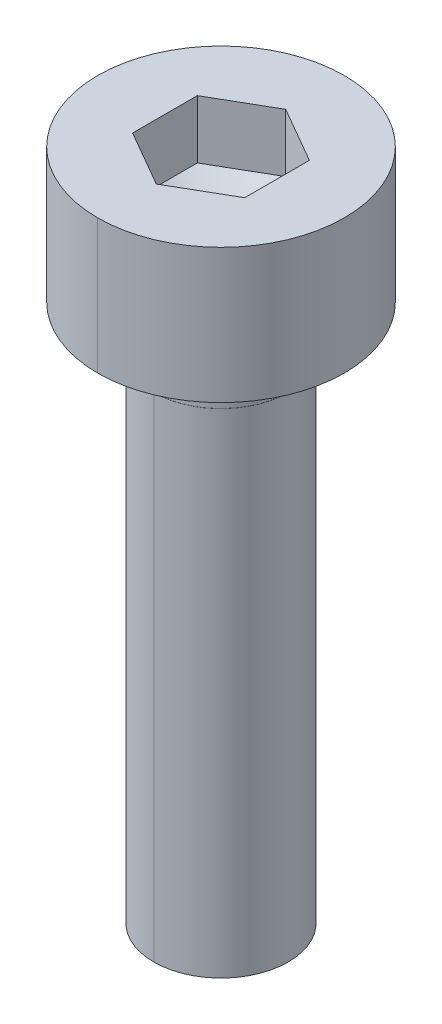
ISO-10303-21;
HEADER;
FILE_DESCRIPTION(('STEP AP214'),'2;1');
FILE_NAME('part.step','',(''),(''),'','','');
FILE_SCHEMA(('AUTOMOTIVE_DESIGN { 1 0 10303 214 1 1 1 1 }'));
ENDSEC;
DATA;
#1=APPLICATION_CONTEXT('core data for automotive mechanical design processes');
#2=APPLICATION_PROTOCOL_DEFINITION('international standard','automotive_design',2000,#1);
#3=PRODUCT_CONTEXT('',#1,'mechanical');
#4=PRODUCT('Part','Part','',(#3));
#5=PRODUCT_RELATED_PRODUCT_CATEGORY('part','',(#4));
#6=PRODUCT_DEFINITION_FORMATION('','',#4);
#7=PRODUCT_DEFINITION_CONTEXT('part definition',#1,'design');
#8=PRODUCT_DEFINITION('design','',#6,#7);
#9=PRODUCT_DEFINITION_SHAPE('','',#8);
#10=(LENGTH_UNIT() NAMED_UNIT(*) SI_UNIT(.MILLI.,.METRE.));
#11=(NAMED_UNIT(*) PLANE_ANGLE_UNIT() SI_UNIT($,.RADIAN.));
#12=(NAMED_UNIT(*) SI_UNIT($,.STERADIAN.) SOLID_ANGLE_UNIT());
#13=UNCERTAINTY_MEASURE_WITH_UNIT(LENGTH_MEASURE(1.E-05),#10,'distance_accuracy_value','');
#14=(GEOMETRIC_REPRESENTATION_CONTEXT(3) GLOBAL_UNCERTAINTY_ASSIGNED_CONTEXT((#13)) GLOBAL_UNIT_ASSIGNED_CONTEXT((#10,
#11,#12)) REPRESENTATION_CONTEXT('',''));
#15=CARTESIAN_POINT('',(0.,0.,0.));
#16=DIRECTION('',(0.,0.,1.));
#17=DIRECTION('',(1.,0.,0.));
#18=AXIS2_PLACEMENT_3D('',#15,#16,#17);
#19=CARTESIAN_POINT('',(45.4663336986831,1131.86666666667,-26.2500000000004));
#20=DIRECTION('',(0.,1.,0.));
#21=DIRECTION('',(0.,0.,-1.));
#22=AXIS2_PLACEMENT_3D('',#19,#20,#21);
#23=CONICAL_SURFACE('',#22,1732.05080756898,1.04719755119662);
#24=DIRECTION('',(0.,0.499999999999979,-0.866025403784451));
#25=VECTOR('',#24,1.);
#26=CARTESIAN_POINT('',(45.466333698683,131.866666666666,-26.25));
#27=LINE('',#26,#25);
#28=CARTESIAN_POINT('',(45.466333698683,131.866666666666,-26.25));
#29=VERTEX_POINT('',#28);
#30=CARTESIAN_POINT('',(45.4663336986831,132.7,-27.6933756729741));
#31=VERTEX_POINT('',#30);
#32=EDGE_CURVE('E192',#29,#31,#27,.T.);
#33=ORIENTED_EDGE('',*,*,#32,.F.);
#34=DIRECTION('',(0.,0.499999999999979,0.866025403784451));
#35=VECTOR('',#34,1.);
#36=CARTESIAN_POINT('',(45.466333698683,131.866666666666,-26.25));
#37=LINE('',#36,#35);
#38=CARTESIAN_POINT('',(45.4663336986829,132.7,-24.8066243270259));
#39=VERTEX_POINT('',#38);
#40=EDGE_CURVE('E750',#29,#39,#37,.T.);
#41=ORIENTED_EDGE('',*,*,#40,.T.);
#42=CARTESIAN_POINT('',(45.466333698683,132.7,-26.25));
#43=DIRECTION('',(0.,1.,0.));
#44=DIRECTION('',(0.,0.,1.));
#45=AXIS2_PLACEMENT_3D('',#42,#43,#44);
#46=CIRCLE('',#45,1.44337567297414);
#47=CARTESIAN_POINT('',(46.716333698683,132.7,-25.5283121635128));
#48=VERTEX_POINT('',#47);
#49=EDGE_CURVE('E201',#39,#48,#46,.T.);
#50=ORIENTED_EDGE('',*,*,#49,.T.);
#51=CARTESIAN_POINT('',(45.466333698683,132.7,-26.25));
#52=DIRECTION('',(0.,1.,0.));
#53=DIRECTION('',(0.,0.,1.));
#54=AXIS2_PLACEMENT_3D('',#51,#52,#53);
#55=CIRCLE('',#54,1.44337567297414);
#56=CARTESIAN_POINT('',(46.716333698683,132.7,-26.971687836487));
#57=VERTEX_POINT('',#56);
#58=EDGE_CURVE('E197',#48,#57,#55,.T.);
#59=ORIENTED_EDGE('',*,*,#58,.T.);
#60=CARTESIAN_POINT('',(45.466333698683,132.7,-26.25));
#61=DIRECTION('',(0.,1.,0.));
#62=DIRECTION('',(0.,0.,1.));
#63=AXIS2_PLACEMENT_3D('',#60,#61,#62);
#64=CIRCLE('',#63,1.44337567297414);
#65=EDGE_CURVE('E213',#57,#31,#64,.T.);
#66=ORIENTED_EDGE('',*,*,#65,.T.);
#67=EDGE_LOOP('',(#33,#41,#50,#59,#66));
#68=FACE_BOUND('',#67,.T.);
#69=ADVANCED_FACE('F17',(#68),#23,.F.);
#70=CARTESIAN_POINT('',(45.466333698683,131.,-26.25));
#71=DIRECTION('',(0.,-1.,0.));
#72=DIRECTION('',(0.,0.,1.));
#73=AXIS2_PLACEMENT_3D('',#70,#71,#72);
#74=CYLINDRICAL_SURFACE('',#73,2.74999999999981);
#75=CARTESIAN_POINT('',(45.466333698683,134.,-26.25));
#76=DIRECTION('',(0.,1.,0.));
#77=DIRECTION('',(0.,0.,1.));
#78=AXIS2_PLACEMENT_3D('',#75,#76,#77);
#79=CIRCLE('',#78,2.74999999999981);
#80=CARTESIAN_POINT('',(45.466333698683,134.,-29.));
#81=VERTEX_POINT('',#80);
#82=CARTESIAN_POINT('',(45.466333698683,134.,-23.5));
#83=VERTEX_POINT('',#82);
#84=EDGE_CURVE('E11',#81,#83,#79,.T.);
#85=ORIENTED_EDGE('',*,*,#84,.F.);
#86=DIRECTION('',(0.,-1.,0.));
#87=VECTOR('',#86,1.);
#88=CARTESIAN_POINT('',(45.466333698683,131.,-29.));
#89=LINE('',#88,#87);
#90=CARTESIAN_POINT('',(45.466333698683,131.,-29.));
#91=VERTEX_POINT('',#90);
#92=EDGE_CURVE('E248',#81,#91,#89,.T.);
#93=ORIENTED_EDGE('',*,*,#92,.T.);
#94=CARTESIAN_POINT('',(45.466333698683,131.,-26.25));
#95=DIRECTION('',(0.,1.,0.));
#96=DIRECTION('',(0.,0.,1.));
#97=AXIS2_PLACEMENT_3D('',#94,#95,#96);
#98=CIRCLE('',#97,2.74999999999981);
#99=CARTESIAN_POINT('',(45.466333698683,131.,-23.5));
#100=VERTEX_POINT('',#99);
#101=EDGE_CURVE('E224',#91,#100,#98,.T.);
#102=ORIENTED_EDGE('',*,*,#101,.T.);
#103=DIRECTION('',(0.,-1.,0.));
#104=VECTOR('',#103,1.);
#105=CARTESIAN_POINT('',(45.466333698683,131.,-23.5));
#106=LINE('',#105,#104);
#107=EDGE_CURVE('E256',#83,#100,#106,.T.);
#108=ORIENTED_EDGE('',*,*,#107,.F.);
#109=EDGE_LOOP('',(#85,#93,#102,#108));
#110=FACE_BOUND('',#109,.T.);
#111=ADVANCED_FACE('F538',(#110),#74,.T.);
#112=CARTESIAN_POINT('',(45.466333698683,131.,-26.25));
#113=DIRECTION('',(0.,-1.,0.));
#114=DIRECTION('',(0.,0.,1.));
#115=AXIS2_PLACEMENT_3D('',#112,#113,#114);
#116=CYLINDRICAL_SURFACE('',#115,1.49750000000015);
#117=CARTESIAN_POINT('',(45.466333698683,131.,-26.25));
#118=DIRECTION('',(0.,1.,0.));
#119=DIRECTION('',(0.,0.,1.));
#120=AXIS2_PLACEMENT_3D('',#117,#118,#119);
#121=CIRCLE('',#120,1.49750000000015);
#122=CARTESIAN_POINT('',(45.466333698683,131.,-27.7475));
#123=VERTEX_POINT('',#122);
#124=CARTESIAN_POINT('',(45.466333698683,131.,-24.7525));
#125=VERTEX_POINT('',#124);
#126=EDGE_CURVE('E266',#123,#125,#121,.T.);
#127=ORIENTED_EDGE('',*,*,#126,.F.);
#128=DIRECTION('',(0.,-1.,0.));
#129=VECTOR('',#128,1.);
#130=CARTESIAN_POINT('',(45.466333698683,131.,-27.7475));
#131=LINE('',#130,#129);
#132=CARTESIAN_POINT('',(45.466333698683,130.,-27.7475));
#133=VERTEX_POINT('',#132);
#134=EDGE_CURVE('E267',#123,#133,#131,.T.);
#135=ORIENTED_EDGE('',*,*,#134,.T.);
#136=CARTESIAN_POINT('',(45.466333698683,130.,-26.25));
#137=DIRECTION('',(0.,1.,0.));
#138=DIRECTION('',(0.,0.,1.));
#139=AXIS2_PLACEMENT_3D('',#136,#137,#138);
#140=CIRCLE('',#139,1.49750000000015);
#141=CARTESIAN_POINT('',(45.466333698683,130.,-24.7525));
#142=VERTEX_POINT('',#141);
#143=EDGE_CURVE('E287',#133,#142,#140,.T.);
#144=ORIENTED_EDGE('',*,*,#143,.T.);
#145=DIRECTION('',(0.,-1.,0.));
#146=VECTOR('',#145,1.);
#147=CARTESIAN_POINT('',(45.466333698683,131.,-24.7525));
#148=LINE('',#147,#146);
#149=EDGE_CURVE('E271',#125,#142,#148,.T.);
#150=ORIENTED_EDGE('',*,*,#149,.F.);
#151=EDGE_LOOP('',(#127,#135,#144,#150));
#152=FACE_BOUND('',#151,.T.);
#153=ADVANCED_FACE('F528',(#152),#116,.T.);
#154=CARTESIAN_POINT('',(45.466333698683,131.,-26.25));
#155=DIRECTION('',(0.,-1.,0.));
#156=DIRECTION('',(0.,0.,1.));
#157=AXIS2_PLACEMENT_3D('',#154,#155,#156);
#158=CYLINDRICAL_SURFACE('',#157,1.50000000000006);
#159=CARTESIAN_POINT('',(45.466333698683,130.,-26.25));
#160=DIRECTION('',(0.,1.,0.));
#161=DIRECTION('',(0.,0.,1.));
#162=AXIS2_PLACEMENT_3D('',#159,#160,#161);
#163=CIRCLE('',#162,1.50000000000006);
#164=CARTESIAN_POINT('',(45.466333698683,130.,-27.75));
#165=VERTEX_POINT('',#164);
#166=CARTESIAN_POINT('',(45.466333698683,130.,-24.75));
#167=VERTEX_POINT('',#166);
#168=EDGE_CURVE('E283',#165,#167,#163,.T.);
#169=ORIENTED_EDGE('',*,*,#168,.F.);
#170=DIRECTION('',(0.,-1.,0.));
#171=VECTOR('',#170,1.);
#172=CARTESIAN_POINT('',(45.466333698683,131.,-27.75));
#173=LINE('',#172,#171);
#174=CARTESIAN_POINT('',(45.466333698683,119.,-27.75));
#175=VERTEX_POINT('',#174);
#176=EDGE_CURVE('E290',#165,#175,#173,.T.);
#177=ORIENTED_EDGE('',*,*,#176,.T.);
#178=CARTESIAN_POINT('',(45.466333698683,119.,-26.25));
#179=DIRECTION('',(0.,1.,0.));
#180=DIRECTION('',(0.,0.,1.));
#181=AXIS2_PLACEMENT_3D('',#178,#179,#180);
#182=CIRCLE('',#181,1.50000000000006);
#183=CARTESIAN_POINT('',(45.466333698683,119.,-24.75));
#184=VERTEX_POINT('',#183);
#185=EDGE_CURVE('E25',#175,#184,#182,.T.);
#186=ORIENTED_EDGE('',*,*,#185,.T.);
#187=DIRECTION('',(0.,-1.,0.));
#188=VECTOR('',#187,1.);
#189=CARTESIAN_POINT('',(45.466333698683,131.,-24.75));
#190=LINE('',#189,#188);
#191=EDGE_CURVE('E293',#167,#184,#190,.T.);
#192=ORIENTED_EDGE('',*,*,#191,.F.);
#193=EDGE_LOOP('',(#169,#177,#186,#192));
#194=FACE_BOUND('',#193,.T.);
#195=ADVANCED_FACE('F465',(#194),#158,.T.);
#196=CARTESIAN_POINT('',(48.2163336986828,134.,-26.25));
#197=DIRECTION('',(0.,1.,0.));
#198=DIRECTION('',(0.,0.,-1.));
#199=AXIS2_PLACEMENT_3D('',#196,#197,#198);
#200=PLANE('',#199);
#201=DIRECTION('',(-0.866025403784439,0.,-0.5));
#202=VECTOR('',#201,1.);
#203=CARTESIAN_POINT('',(45.466333698683,134.,-24.8066243270259));
#204=LINE('',#203,#202);
#205=CARTESIAN_POINT('',(45.466333698683,134.,-24.8066243270259));
#206=VERTEX_POINT('',#205);
#207=CARTESIAN_POINT('',(44.216333698683,134.,-25.5283121635129));
#208=VERTEX_POINT('',#207);
#209=EDGE_CURVE('E151',#206,#208,#204,.T.);
#210=ORIENTED_EDGE('',*,*,#209,.T.);
#211=DIRECTION('',(0.,0.,-1.));
#212=VECTOR('',#211,1.);
#213=CARTESIAN_POINT('',(44.216333698683,134.,-25.5283121635129));
#214=LINE('',#213,#212);
#215=CARTESIAN_POINT('',(44.216333698683,134.,-26.971687836487));
#216=VERTEX_POINT('',#215);
#217=EDGE_CURVE('E147',#208,#216,#214,.T.);
#218=ORIENTED_EDGE('',*,*,#217,.T.);
#219=DIRECTION('',(0.866025403784439,0.,-0.5));
#220=VECTOR('',#219,1.);
#221=CARTESIAN_POINT('',(44.216333698683,134.,-26.971687836487));
#222=LINE('',#221,#220);
#223=CARTESIAN_POINT('',(45.466333698683,134.,-27.693375672974));
#224=VERTEX_POINT('',#223);
#225=EDGE_CURVE('E235',#216,#224,#222,.T.);
#226=ORIENTED_EDGE('',*,*,#225,.T.);
#227=DIRECTION('',(0.866025403784439,0.,0.5));
#228=VECTOR('',#227,1.);
#229=CARTESIAN_POINT('',(45.466333698683,134.,-27.693375672974));
#230=LINE('',#229,#228);
#231=CARTESIAN_POINT('',(46.716333698683,134.,-26.971687836487));
#232=VERTEX_POINT('',#231);
#233=EDGE_CURVE('E231',#224,#232,#230,.T.);
#234=ORIENTED_EDGE('',*,*,#233,.T.);
#235=DIRECTION('',(0.,0.,1.));
#236=VECTOR('',#235,1.);
#237=CARTESIAN_POINT('',(46.716333698683,134.,-26.971687836487));
#238=LINE('',#237,#236);
#239=CARTESIAN_POINT('',(46.716333698683,134.,-25.5283121635129));
#240=VERTEX_POINT('',#239);
#241=EDGE_CURVE('E217',#232,#240,#238,.T.);
#242=ORIENTED_EDGE('',*,*,#241,.T.);
#243=DIRECTION('',(-0.866025403784439,0.,0.5));
#244=VECTOR('',#243,1.);
#245=CARTESIAN_POINT('',(46.716333698683,134.,-25.5283121635129));
#246=LINE('',#245,#244);
#247=EDGE_CURVE('E247',#240,#206,#246,.T.);
#248=ORIENTED_EDGE('',*,*,#247,.T.);
#249=EDGE_LOOP('',(#210,#218,#226,#234,#242,#248));
#250=FACE_BOUND('',#249,.T.);
#251=CARTESIAN_POINT('',(45.466333698683,134.,-26.25));
#252=DIRECTION('',(0.,1.,0.));
#253=DIRECTION('',(0.,0.,1.));
#254=AXIS2_PLACEMENT_3D('',#251,#252,#253);
#255=CIRCLE('',#254,2.74999999999981);
#256=EDGE_CURVE('E252',#83,#81,#255,.T.);
#257=ORIENTED_EDGE('',*,*,#256,.T.);
#258=ORIENTED_EDGE('',*,*,#84,.T.);
#259=EDGE_LOOP('',(#257,#258));
#260=FACE_BOUND('',#259,.T.);
#261=ADVANCED_FACE('F460',(#250,#260),#200,.T.);
#262=CARTESIAN_POINT('',(45.466333698683,119.,-26.25));
#263=DIRECTION('',(0.,-1.,0.));
#264=DIRECTION('',(-1.,0.,0.));
#265=AXIS2_PLACEMENT_3D('',#262,#263,#264);
#266=PLANE('',#265);
#267=CARTESIAN_POINT('',(45.466333698683,119.,-26.25));
#268=DIRECTION('',(0.,1.,0.));
#269=DIRECTION('',(0.,0.,1.));
#270=AXIS2_PLACEMENT_3D('',#267,#268,#269);
#271=CIRCLE('',#270,1.50000000000006);
#272=EDGE_CURVE('E297',#184,#175,#271,.T.);
#273=ORIENTED_EDGE('',*,*,#272,.F.);
#274=ORIENTED_EDGE('',*,*,#185,.F.);
#275=EDGE_LOOP('',(#273,#274));
#276=FACE_BOUND('',#275,.T.);
#277=ADVANCED_FACE('F464',(#276),#266,.T.);
#278=CARTESIAN_POINT('',(45.466333698683,131.,-26.25));
#279=DIRECTION('',(0.,-1.,0.));
#280=DIRECTION('',(0.,0.,1.));
#281=AXIS2_PLACEMENT_3D('',#278,#279,#280);
#282=CYLINDRICAL_SURFACE('',#281,1.50000000000006);
#283=ORIENTED_EDGE('',*,*,#176,.F.);
#284=CARTESIAN_POINT('',(45.466333698683,130.,-26.25));
#285=DIRECTION('',(0.,1.,0.));
#286=DIRECTION('',(0.,0.,1.));
#287=AXIS2_PLACEMENT_3D('',#284,#285,#286);
#288=CIRCLE('',#287,1.50000000000006);
#289=EDGE_CURVE('E279',#167,#165,#288,.T.);
#290=ORIENTED_EDGE('',*,*,#289,.F.);
#291=ORIENTED_EDGE('',*,*,#191,.T.);
#292=ORIENTED_EDGE('',*,*,#272,.T.);
#293=EDGE_LOOP('',(#283,#290,#291,#292));
#294=FACE_BOUND('',#293,.T.);
#295=ADVANCED_FACE('F498',(#294),#282,.T.);
#296=CARTESIAN_POINT('',(46.9663336986831,130.,-26.25));
#297=DIRECTION('',(0.,1.,0.));
#298=DIRECTION('',(0.,0.,-1.));
#299=AXIS2_PLACEMENT_3D('',#296,#297,#298);
#300=PLANE('',#299);
#301=CARTESIAN_POINT('',(45.466333698683,130.,-26.25));
#302=DIRECTION('',(0.,1.,0.));
#303=DIRECTION('',(0.,0.,1.));
#304=AXIS2_PLACEMENT_3D('',#301,#302,#303);
#305=CIRCLE('',#304,1.49750000000015);
#306=EDGE_CURVE('E275',#142,#133,#305,.T.);
#307=ORIENTED_EDGE('',*,*,#306,.F.);
#308=ORIENTED_EDGE('',*,*,#143,.F.);
#309=EDGE_LOOP('',(#307,#308));
#310=FACE_BOUND('',#309,.T.);
#311=ORIENTED_EDGE('',*,*,#289,.T.);
#312=ORIENTED_EDGE('',*,*,#168,.T.);
#313=EDGE_LOOP('',(#311,#312));
#314=FACE_BOUND('',#313,.T.);
#315=ADVANCED_FACE('F487',(#310,#314),#300,.T.);
#316=CARTESIAN_POINT('',(45.466333698683,131.,-26.25));
#317=DIRECTION('',(0.,-1.,0.));
#318=DIRECTION('',(0.,0.,1.));
#319=AXIS2_PLACEMENT_3D('',#316,#317,#318);
#320=CYLINDRICAL_SURFACE('',#319,1.49750000000015);
#321=ORIENTED_EDGE('',*,*,#134,.F.);
#322=CARTESIAN_POINT('',(45.466333698683,131.,-26.25));
#323=DIRECTION('',(0.,1.,0.));
#324=DIRECTION('',(0.,0.,1.));
#325=AXIS2_PLACEMENT_3D('',#322,#323,#324);
#326=CIRCLE('',#325,1.49750000000015);
#327=EDGE_CURVE('E227',#125,#123,#326,.T.);
#328=ORIENTED_EDGE('',*,*,#327,.F.);
#329=ORIENTED_EDGE('',*,*,#149,.T.);
#330=ORIENTED_EDGE('',*,*,#306,.T.);
#331=EDGE_LOOP('',(#321,#328,#329,#330));
#332=FACE_BOUND('',#331,.T.);
#333=ADVANCED_FACE('F476',(#332),#320,.T.);
#334=CARTESIAN_POINT('',(45.466333698683,131.,-26.25));
#335=DIRECTION('',(0.,-1.,0.));
#336=DIRECTION('',(-1.,0.,0.));
#337=AXIS2_PLACEMENT_3D('',#334,#335,#336);
#338=PLANE('',#337);
#339=ORIENTED_EDGE('',*,*,#327,.T.);
#340=ORIENTED_EDGE('',*,*,#126,.T.);
#341=EDGE_LOOP('',(#339,#340));
#342=FACE_BOUND('',#341,.T.);
#343=CARTESIAN_POINT('',(45.466333698683,131.,-26.25));
#344=DIRECTION('',(0.,1.,0.));
#345=DIRECTION('',(0.,0.,1.));
#346=AXIS2_PLACEMENT_3D('',#343,#344,#345);
#347=CIRCLE('',#346,2.74999999999981);
#348=EDGE_CURVE('E228',#100,#91,#347,.T.);
#349=ORIENTED_EDGE('',*,*,#348,.F.);
#350=ORIENTED_EDGE('',*,*,#101,.F.);
#351=EDGE_LOOP('',(#349,#350));
#352=FACE_BOUND('',#351,.T.);
#353=ADVANCED_FACE('F319',(#342,#352),#338,.T.);
#354=CARTESIAN_POINT('',(45.466333698683,131.,-26.25));
#355=DIRECTION('',(0.,-1.,0.));
#356=DIRECTION('',(0.,0.,1.));
#357=AXIS2_PLACEMENT_3D('',#354,#355,#356);
#358=CYLINDRICAL_SURFACE('',#357,2.74999999999981);
#359=ORIENTED_EDGE('',*,*,#92,.F.);
#360=ORIENTED_EDGE('',*,*,#256,.F.);
#361=ORIENTED_EDGE('',*,*,#107,.T.);
#362=ORIENTED_EDGE('',*,*,#348,.T.);
#363=EDGE_LOOP('',(#359,#360,#361,#362));
#364=FACE_BOUND('',#363,.T.);
#365=ADVANCED_FACE('F313',(#364),#358,.T.);
#366=CARTESIAN_POINT('',(46.716333698683,134.,-25.5283121635129));
#367=DIRECTION('',(-0.5,0.,-0.866025403784439));
#368=DIRECTION('',(-0.866025403784439,0.,0.5));
#369=AXIS2_PLACEMENT_3D('',#366,#367,#368);
#370=PLANE('',#369);
#371=DIRECTION('',(-0.866025403784439,0.,0.5));
#372=VECTOR('',#371,1.);
#373=CARTESIAN_POINT('',(46.716333698683,132.7,-25.5283121635129));
#374=LINE('',#373,#372);
#375=EDGE_CURVE('E163',#48,#39,#374,.T.);
#376=ORIENTED_EDGE('',*,*,#375,.T.);
#377=DIRECTION('',(0.,-1.,0.));
#378=VECTOR('',#377,1.);
#379=CARTESIAN_POINT('',(45.466333698683,134.,-24.8066243270259));
#380=LINE('',#379,#378);
#381=EDGE_CURVE('E157',#206,#39,#380,.T.);
#382=ORIENTED_EDGE('',*,*,#381,.F.);
#383=ORIENTED_EDGE('',*,*,#247,.F.);
#384=DIRECTION('',(0.,-1.,0.));
#385=VECTOR('',#384,1.);
#386=CARTESIAN_POINT('',(46.716333698683,134.,-25.5283121635129));
#387=LINE('',#386,#385);
#388=EDGE_CURVE('E209',#240,#48,#387,.T.);
#389=ORIENTED_EDGE('',*,*,#388,.T.);
#390=EDGE_LOOP('',(#376,#382,#383,#389));
#391=FACE_BOUND('',#390,.T.);
#392=ADVANCED_FACE('F318',(#391),#370,.T.);
#393=CARTESIAN_POINT('',(45.466333698683,134.,-24.8066243270259));
#394=DIRECTION('',(0.5,0.,-0.866025403784439));
#395=DIRECTION('',(0.,-1.,0.));
#396=AXIS2_PLACEMENT_3D('',#393,#394,#395);
#397=PLANE('',#396);
#398=DIRECTION('',(-0.866025403784439,0.,-0.5));
#399=VECTOR('',#398,1.);
#400=CARTESIAN_POINT('',(45.466333698683,132.7,-24.8066243270259));
#401=LINE('',#400,#399);
#402=CARTESIAN_POINT('',(44.2163336986828,132.7,-25.528312163513));
#403=VERTEX_POINT('',#402);
#404=EDGE_CURVE('E154',#39,#403,#401,.T.);
#405=ORIENTED_EDGE('',*,*,#404,.T.);
#406=DIRECTION('',(0.,-1.,0.));
#407=VECTOR('',#406,1.);
#408=CARTESIAN_POINT('',(44.216333698683,134.,-25.5283121635129));
#409=LINE('',#408,#407);
#410=EDGE_CURVE('E140',#208,#403,#409,.T.);
#411=ORIENTED_EDGE('',*,*,#410,.F.);
#412=ORIENTED_EDGE('',*,*,#209,.F.);
#413=ORIENTED_EDGE('',*,*,#381,.T.);
#414=EDGE_LOOP('',(#405,#411,#412,#413));
#415=FACE_BOUND('',#414,.T.);
#416=ADVANCED_FACE('F155',(#415),#397,.T.);
#417=CARTESIAN_POINT('',(44.216333698683,134.,-25.5283121635129));
#418=DIRECTION('',(1.,0.,0.));
#419=DIRECTION('',(0.,-1.,0.));
#420=AXIS2_PLACEMENT_3D('',#417,#418,#419);
#421=PLANE('',#420);
#422=DIRECTION('',(0.,0.,-1.));
#423=VECTOR('',#422,1.);
#424=CARTESIAN_POINT('',(44.216333698683,132.7,-25.5283121635129));
#425=LINE('',#424,#423);
#426=CARTESIAN_POINT('',(44.216333698683,132.7,-26.9716878364872));
#427=VERTEX_POINT('',#426);
#428=EDGE_CURVE('E145',#403,#427,#425,.T.);
#429=ORIENTED_EDGE('',*,*,#428,.T.);
#430=DIRECTION('',(0.,-1.,0.));
#431=VECTOR('',#430,1.);
#432=CARTESIAN_POINT('',(44.216333698683,134.,-26.971687836487));
#433=LINE('',#432,#431);
#434=EDGE_CURVE('E238',#216,#427,#433,.T.);
#435=ORIENTED_EDGE('',*,*,#434,.F.);
#436=ORIENTED_EDGE('',*,*,#217,.F.);
#437=ORIENTED_EDGE('',*,*,#410,.T.);
#438=EDGE_LOOP('',(#429,#435,#436,#437));
#439=FACE_BOUND('',#438,.T.);
#440=ADVANCED_FACE('F142',(#439),#421,.T.);
#441=CARTESIAN_POINT('',(44.216333698683,134.,-26.971687836487));
#442=DIRECTION('',(0.5,0.,0.866025403784439));
#443=DIRECTION('',(0.,-1.,0.));
#444=AXIS2_PLACEMENT_3D('',#441,#442,#443);
#445=PLANE('',#444);
#446=DIRECTION('',(0.866025403784439,0.,-0.5));
#447=VECTOR('',#446,1.);
#448=CARTESIAN_POINT('',(44.216333698683,132.7,-26.971687836487));
#449=LINE('',#448,#447);
#450=EDGE_CURVE('E172',#427,#31,#449,.T.);
#451=ORIENTED_EDGE('',*,*,#450,.T.);
#452=DIRECTION('',(0.,-1.,0.));
#453=VECTOR('',#452,1.);
#454=CARTESIAN_POINT('',(45.466333698683,134.,-27.693375672974));
#455=LINE('',#454,#453);
#456=EDGE_CURVE('E232',#224,#31,#455,.T.);
#457=ORIENTED_EDGE('',*,*,#456,.F.);
#458=ORIENTED_EDGE('',*,*,#225,.F.);
#459=ORIENTED_EDGE('',*,*,#434,.T.);
#460=EDGE_LOOP('',(#451,#457,#458,#459));
#461=FACE_BOUND('',#460,.T.);
#462=ADVANCED_FACE('F392',(#461),#445,.T.);
#463=CARTESIAN_POINT('',(45.466333698683,134.,-27.693375672974));
#464=DIRECTION('',(-0.5,0.,0.866025403784439));
#465=DIRECTION('',(0.,1.,0.));
#466=AXIS2_PLACEMENT_3D('',#463,#464,#465);
#467=PLANE('',#466);
#468=DIRECTION('',(0.866025403784439,0.,0.5));
#469=VECTOR('',#468,1.);
#470=CARTESIAN_POINT('',(45.466333698683,132.7,-27.693375672974));
#471=LINE('',#470,#469);
#472=EDGE_CURVE('E205',#31,#57,#471,.T.);
#473=ORIENTED_EDGE('',*,*,#472,.T.);
#474=DIRECTION('',(0.,-1.,0.));
#475=VECTOR('',#474,1.);
#476=CARTESIAN_POINT('',(46.716333698683,134.,-26.971687836487));
#477=LINE('',#476,#475);
#478=EDGE_CURVE('E220',#232,#57,#477,.T.);
#479=ORIENTED_EDGE('',*,*,#478,.F.);
#480=ORIENTED_EDGE('',*,*,#233,.F.);
#481=ORIENTED_EDGE('',*,*,#456,.T.);
#482=EDGE_LOOP('',(#473,#479,#480,#481));
#483=FACE_BOUND('',#482,.T.);
#484=ADVANCED_FACE('F402',(#483),#467,.T.);
#485=CARTESIAN_POINT('',(46.716333698683,134.,-26.971687836487));
#486=DIRECTION('',(-1.,0.,0.));
#487=DIRECTION('',(0.,0.,1.));
#488=AXIS2_PLACEMENT_3D('',#485,#486,#487);
#489=PLANE('',#488);
#490=DIRECTION('',(0.,0.,1.));
#491=VECTOR('',#490,1.);
#492=CARTESIAN_POINT('',(46.716333698683,132.7,-26.971687836487));
#493=LINE('',#492,#491);
#494=EDGE_CURVE('E180',#57,#48,#493,.T.);
#495=ORIENTED_EDGE('',*,*,#494,.T.);
#496=ORIENTED_EDGE('',*,*,#388,.F.);
#497=ORIENTED_EDGE('',*,*,#241,.F.);
#498=ORIENTED_EDGE('',*,*,#478,.T.);
#499=EDGE_LOOP('',(#495,#496,#497,#498));
#500=FACE_BOUND('',#499,.T.);
#501=ADVANCED_FACE('F413',(#500),#489,.T.);
#502=CARTESIAN_POINT('',(46.9097093716571,132.7,-26.25));
#503=DIRECTION('',(0.,1.,0.));
#504=DIRECTION('',(0.,0.,-1.));
#505=AXIS2_PLACEMENT_3D('',#502,#503,#504);
#506=PLANE('',#505);
#507=ORIENTED_EDGE('',*,*,#375,.F.);
#508=ORIENTED_EDGE('',*,*,#49,.F.);
#509=EDGE_LOOP('',(#507,#508));
#510=FACE_BOUND('',#509,.T.);
#511=ADVANCED_FACE('F353',(#510),#506,.F.);
#512=CARTESIAN_POINT('',(46.9097093716571,132.7,-26.25));
#513=DIRECTION('',(0.,1.,0.));
#514=DIRECTION('',(0.,0.,-1.));
#515=AXIS2_PLACEMENT_3D('',#512,#513,#514);
#516=PLANE('',#515);
#517=ORIENTED_EDGE('',*,*,#404,.F.);
#518=CARTESIAN_POINT('',(45.466333698683,132.7,-26.25));
#519=DIRECTION('',(0.,1.,0.));
#520=DIRECTION('',(0.,0.,1.));
#521=AXIS2_PLACEMENT_3D('',#518,#519,#520);
#522=CIRCLE('',#521,1.44337567297414);
#523=EDGE_CURVE('E174',#403,#39,#522,.T.);
#524=ORIENTED_EDGE('',*,*,#523,.F.);
#525=EDGE_LOOP('',(#517,#524));
#526=FACE_BOUND('',#525,.T.);
#527=ADVANCED_FACE('F175',(#526),#516,.F.);
#528=CARTESIAN_POINT('',(46.9097093716571,132.7,-26.25));
#529=DIRECTION('',(0.,1.,0.));
#530=DIRECTION('',(0.,0.,-1.));
#531=AXIS2_PLACEMENT_3D('',#528,#529,#530);
#532=PLANE('',#531);
#533=ORIENTED_EDGE('',*,*,#428,.F.);
#534=CARTESIAN_POINT('',(45.466333698683,132.7,-26.25));
#535=DIRECTION('',(0.,1.,0.));
#536=DIRECTION('',(0.,0.,1.));
#537=AXIS2_PLACEMENT_3D('',#534,#535,#536);
#538=CIRCLE('',#537,1.44337567297414);
#539=EDGE_CURVE('E169',#427,#403,#538,.T.);
#540=ORIENTED_EDGE('',*,*,#539,.F.);
#541=EDGE_LOOP('',(#533,#540));
#542=FACE_BOUND('',#541,.T.);
#543=ADVANCED_FACE('F167',(#542),#532,.F.);
#544=CARTESIAN_POINT('',(46.9097093716571,132.7,-26.25));
#545=DIRECTION('',(0.,1.,0.));
#546=DIRECTION('',(0.,0.,-1.));
#547=AXIS2_PLACEMENT_3D('',#544,#545,#546);
#548=PLANE('',#547);
#549=ORIENTED_EDGE('',*,*,#450,.F.);
#550=CARTESIAN_POINT('',(45.466333698683,132.7,-26.25));
#551=DIRECTION('',(0.,1.,0.));
#552=DIRECTION('',(0.,0.,1.));
#553=AXIS2_PLACEMENT_3D('',#550,#551,#552);
#554=CIRCLE('',#553,1.44337567297414);
#555=EDGE_CURVE('E185',#31,#427,#554,.T.);
#556=ORIENTED_EDGE('',*,*,#555,.F.);
#557=EDGE_LOOP('',(#549,#556));
#558=FACE_BOUND('',#557,.T.);
#559=ADVANCED_FACE('F342',(#558),#548,.F.);
#560=CARTESIAN_POINT('',(46.9097093716571,132.7,-26.25));
#561=DIRECTION('',(0.,1.,0.));
#562=DIRECTION('',(0.,0.,-1.));
#563=AXIS2_PLACEMENT_3D('',#560,#561,#562);
#564=PLANE('',#563);
#565=ORIENTED_EDGE('',*,*,#472,.F.);
#566=ORIENTED_EDGE('',*,*,#65,.F.);
#567=EDGE_LOOP('',(#565,#566));
#568=FACE_BOUND('',#567,.T.);
#569=ADVANCED_FACE('F338',(#568),#564,.F.);
#570=CARTESIAN_POINT('',(46.9097093716571,132.7,-26.25));
#571=DIRECTION('',(0.,1.,0.));
#572=DIRECTION('',(0.,0.,-1.));
#573=AXIS2_PLACEMENT_3D('',#570,#571,#572);
#574=PLANE('',#573);
#575=ORIENTED_EDGE('',*,*,#494,.F.);
#576=ORIENTED_EDGE('',*,*,#58,.F.);
#577=EDGE_LOOP('',(#575,#576));
#578=FACE_BOUND('',#577,.T.);
#579=ADVANCED_FACE('F331',(#578),#574,.F.);
#580=CARTESIAN_POINT('',(45.4663336986831,1131.86666666667,-26.2500000000004));
#581=DIRECTION('',(0.,1.,0.));
#582=DIRECTION('',(0.,0.,-1.));
#583=AXIS2_PLACEMENT_3D('',#580,#581,#582);
#584=CONICAL_SURFACE('',#583,1732.05080756898,1.04719755119662);
#585=ORIENTED_EDGE('',*,*,#40,.F.);
#586=ORIENTED_EDGE('',*,*,#32,.T.);
#587=ORIENTED_EDGE('',*,*,#555,.T.);
#588=ORIENTED_EDGE('',*,*,#539,.T.);
#589=ORIENTED_EDGE('',*,*,#523,.T.);
#590=EDGE_LOOP('',(#585,#586,#587,#588,#589));
#591=FACE_BOUND('',#590,.T.);
#592=ADVANCED_FACE('F182',(#591),#584,.F.);
#593=CLOSED_SHELL('',(#69,#111,#153,#195,#261,#277,#295,#315,#333,#353,#365,#392,#416,#440,#462,
#484,#501,#511,#527,#543,#559,#569,#579,#592));
#594=MANIFOLD_SOLID_BREP('B1',#593);
#595=ADVANCED_BREP_SHAPE_REPRESENTATION('',(#18,#594),#14);
#596=SHAPE_DEFINITION_REPRESENTATION(#9,#595);
ENDSEC;
END-ISO-10303-21;
